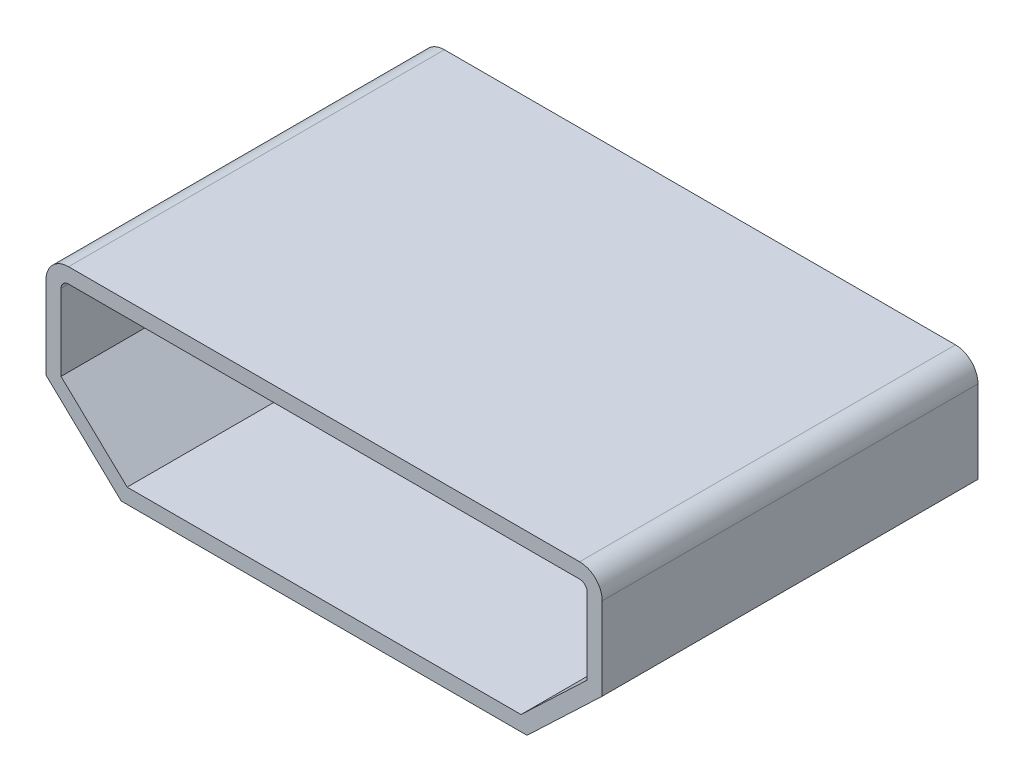
ISO-10303-21;
HEADER;
FILE_DESCRIPTION(('STEP AP214'),'2;1');
FILE_NAME('part.step','',(''),(''),'','','');
FILE_SCHEMA(('AUTOMOTIVE_DESIGN { 1 0 10303 214 1 1 1 1 }'));
ENDSEC;
DATA;
#1=APPLICATION_CONTEXT('core data for automotive mechanical design processes');
#2=APPLICATION_PROTOCOL_DEFINITION('international standard','automotive_design',2000,#1);
#3=PRODUCT_CONTEXT('',#1,'mechanical');
#4=PRODUCT('Part','Part','',(#3));
#5=PRODUCT_RELATED_PRODUCT_CATEGORY('part','',(#4));
#6=PRODUCT_DEFINITION_FORMATION('','',#4);
#7=PRODUCT_DEFINITION_CONTEXT('part definition',#1,'design');
#8=PRODUCT_DEFINITION('design','',#6,#7);
#9=PRODUCT_DEFINITION_SHAPE('','',#8);
#10=(LENGTH_UNIT() NAMED_UNIT(*) SI_UNIT(.MILLI.,.METRE.));
#11=(NAMED_UNIT(*) PLANE_ANGLE_UNIT() SI_UNIT($,.RADIAN.));
#12=(NAMED_UNIT(*) SI_UNIT($,.STERADIAN.) SOLID_ANGLE_UNIT());
#13=UNCERTAINTY_MEASURE_WITH_UNIT(LENGTH_MEASURE(1.E-05),#10,'distance_accuracy_value','');
#14=(GEOMETRIC_REPRESENTATION_CONTEXT(3) GLOBAL_UNCERTAINTY_ASSIGNED_CONTEXT((#13)) GLOBAL_UNIT_ASSIGNED_CONTEXT((#10,
#11,#12)) REPRESENTATION_CONTEXT('',''));
#15=CARTESIAN_POINT('',(0.,0.,0.));
#16=DIRECTION('',(0.,0.,1.));
#17=DIRECTION('',(1.,0.,0.));
#18=AXIS2_PLACEMENT_3D('',#15,#16,#17);
#19=CARTESIAN_POINT('',(3.7,2.35,2.5));
#20=DIRECTION('',(-1.,0.,0.));
#21=DIRECTION('',(0.,0.,1.));
#22=AXIS2_PLACEMENT_3D('',#19,#20,#21);
#23=PLANE('',#22);
#24=DIRECTION('',(0.,-1.,0.));
#25=VECTOR('',#24,1.);
#26=CARTESIAN_POINT('',(3.7,2.35,2.5));
#27=LINE('',#26,#25);
#28=CARTESIAN_POINT('',(3.7,2.05,2.5));
#29=VERTEX_POINT('',#28);
#30=CARTESIAN_POINT('',(3.7,0.95,2.5));
#31=VERTEX_POINT('',#30);
#32=EDGE_CURVE('E263',#29,#31,#27,.T.);
#33=ORIENTED_EDGE('',*,*,#32,.T.);
#34=DIRECTION('',(0.,0.,1.));
#35=VECTOR('',#34,1.);
#36=CARTESIAN_POINT('',(3.7,0.95,-2.5));
#37=LINE('',#36,#35);
#38=CARTESIAN_POINT('',(3.7,0.95,-2.5));
#39=VERTEX_POINT('',#38);
#40=EDGE_CURVE('E241',#39,#31,#37,.T.);
#41=ORIENTED_EDGE('',*,*,#40,.F.);
#42=DIRECTION('',(0.,-1.,0.));
#43=VECTOR('',#42,1.);
#44=CARTESIAN_POINT('',(3.7,2.35,-2.5));
#45=LINE('',#44,#43);
#46=CARTESIAN_POINT('',(3.7,2.05,-2.5));
#47=VERTEX_POINT('',#46);
#48=EDGE_CURVE('E11',#47,#39,#45,.T.);
#49=ORIENTED_EDGE('',*,*,#48,.F.);
#50=DIRECTION('',(0.,0.,1.));
#51=VECTOR('',#50,1.);
#52=CARTESIAN_POINT('',(3.7,2.05,-2.5));
#53=LINE('',#52,#51);
#54=EDGE_CURVE('E221',#47,#29,#53,.T.);
#55=ORIENTED_EDGE('',*,*,#54,.T.);
#56=EDGE_LOOP('',(#33,#41,#49,#55));
#57=FACE_BOUND('',#56,.T.);
#58=ADVANCED_FACE('F35',(#57),#23,.F.);
#59=CARTESIAN_POINT('',(0.,2.35,0.));
#60=DIRECTION('',(0.,-1.,0.));
#61=DIRECTION('',(0.,0.,-1.));
#62=AXIS2_PLACEMENT_3D('',#59,#60,#61);
#63=PLANE('',#62);
#64=DIRECTION('',(0.,0.,1.));
#65=VECTOR('',#64,1.);
#66=CARTESIAN_POINT('',(-3.4,2.35,-2.5));
#67=LINE('',#66,#65);
#68=CARTESIAN_POINT('',(-3.4,2.35,-2.5));
#69=VERTEX_POINT('',#68);
#70=CARTESIAN_POINT('',(-3.4,2.35,2.5));
#71=VERTEX_POINT('',#70);
#72=EDGE_CURVE('E233',#69,#71,#67,.T.);
#73=ORIENTED_EDGE('',*,*,#72,.T.);
#74=DIRECTION('',(1.,0.,0.));
#75=VECTOR('',#74,1.);
#76=CARTESIAN_POINT('',(-3.7,2.35,2.5));
#77=LINE('',#76,#75);
#78=CARTESIAN_POINT('',(3.4,2.35,2.5));
#79=VERTEX_POINT('',#78);
#80=EDGE_CURVE('E259',#71,#79,#77,.T.);
#81=ORIENTED_EDGE('',*,*,#80,.T.);
#82=DIRECTION('',(0.,0.,1.));
#83=VECTOR('',#82,1.);
#84=CARTESIAN_POINT('',(3.4,2.35,-2.5));
#85=LINE('',#84,#83);
#86=CARTESIAN_POINT('',(3.4,2.35,-2.5));
#87=VERTEX_POINT('',#86);
#88=EDGE_CURVE('E225',#87,#79,#85,.T.);
#89=ORIENTED_EDGE('',*,*,#88,.F.);
#90=DIRECTION('',(-1.,0.,0.));
#91=VECTOR('',#90,1.);
#92=CARTESIAN_POINT('',(-3.7,2.35,-2.5));
#93=LINE('',#92,#91);
#94=EDGE_CURVE('E256',#87,#69,#93,.T.);
#95=ORIENTED_EDGE('',*,*,#94,.T.);
#96=EDGE_LOOP('',(#73,#81,#89,#95));
#97=FACE_BOUND('',#96,.T.);
#98=ADVANCED_FACE('F297',(#97),#63,.F.);
#99=CARTESIAN_POINT('',(-3.7,2.35,-2.5));
#100=DIRECTION('',(0.,0.,1.));
#101=DIRECTION('',(1.,0.,0.));
#102=AXIS2_PLACEMENT_3D('',#99,#100,#101);
#103=PLANE('',#102);
#104=ORIENTED_EDGE('',*,*,#48,.T.);
#105=DIRECTION('',(-0.724999433594414,-0.688749461914693,0.));
#106=VECTOR('',#105,1.);
#107=CARTESIAN_POINT('',(2.7,0.,-2.5));
#108=LINE('',#107,#106);
#109=CARTESIAN_POINT('',(2.7,0.,-2.5));
#110=VERTEX_POINT('',#109);
#111=EDGE_CURVE('E238',#39,#110,#108,.T.);
#112=ORIENTED_EDGE('',*,*,#111,.T.);
#113=DIRECTION('',(-1.,0.,0.));
#114=VECTOR('',#113,1.);
#115=CARTESIAN_POINT('',(-3.7,0.,-2.5));
#116=LINE('',#115,#114);
#117=CARTESIAN_POINT('',(-2.7,0.,-2.5));
#118=VERTEX_POINT('',#117);
#119=EDGE_CURVE('E254',#110,#118,#116,.T.);
#120=ORIENTED_EDGE('',*,*,#119,.T.);
#121=DIRECTION('',(-0.724999433594414,0.688749461914693,0.));
#122=VECTOR('',#121,1.);
#123=CARTESIAN_POINT('',(-2.7,0.,-2.5));
#124=LINE('',#123,#122);
#125=CARTESIAN_POINT('',(-3.7,0.95,-2.5));
#126=VERTEX_POINT('',#125);
#127=EDGE_CURVE('E246',#118,#126,#124,.T.);
#128=ORIENTED_EDGE('',*,*,#127,.T.);
#129=DIRECTION('',(0.,-1.,0.));
#130=VECTOR('',#129,1.);
#131=CARTESIAN_POINT('',(-3.7,2.35,-2.5));
#132=LINE('',#131,#130);
#133=CARTESIAN_POINT('',(-3.7,2.05,-2.5));
#134=VERTEX_POINT('',#133);
#135=EDGE_CURVE('E42',#134,#126,#132,.T.);
#136=ORIENTED_EDGE('',*,*,#135,.F.);
#137=CARTESIAN_POINT('',(-3.4,2.05,-2.5));
#138=DIRECTION('',(0.,0.,-1.));
#139=DIRECTION('',(-1.,0.,0.));
#140=AXIS2_PLACEMENT_3D('',#137,#138,#139);
#141=CIRCLE('',#140,0.3);
#142=EDGE_CURVE('E230',#134,#69,#141,.T.);
#143=ORIENTED_EDGE('',*,*,#142,.T.);
#144=ORIENTED_EDGE('',*,*,#94,.F.);
#145=CARTESIAN_POINT('',(3.4,2.05,-2.5));
#146=DIRECTION('',(0.,0.,-1.));
#147=DIRECTION('',(1.,0.,0.));
#148=AXIS2_PLACEMENT_3D('',#145,#146,#147);
#149=CIRCLE('',#148,0.3);
#150=EDGE_CURVE('E218',#87,#47,#149,.T.);
#151=ORIENTED_EDGE('',*,*,#150,.T.);
#152=EDGE_LOOP('',(#104,#112,#120,#128,#136,#143,#144,#151));
#153=FACE_BOUND('',#152,.T.);
#154=ADVANCED_FACE('F279',(#153),#103,.F.);
#155=CARTESIAN_POINT('',(-3.7,2.35,2.5));
#156=DIRECTION('',(1.,0.,0.));
#157=DIRECTION('',(0.,0.,-1.));
#158=AXIS2_PLACEMENT_3D('',#155,#156,#157);
#159=PLANE('',#158);
#160=DIRECTION('',(0.,-1.,0.));
#161=VECTOR('',#160,1.);
#162=CARTESIAN_POINT('',(-3.7,2.35,2.5));
#163=LINE('',#162,#161);
#164=CARTESIAN_POINT('',(-3.7,2.05,2.5));
#165=VERTEX_POINT('',#164);
#166=CARTESIAN_POINT('',(-3.7,0.95,2.5));
#167=VERTEX_POINT('',#166);
#168=EDGE_CURVE('E270',#165,#167,#163,.T.);
#169=ORIENTED_EDGE('',*,*,#168,.F.);
#170=DIRECTION('',(0.,0.,1.));
#171=VECTOR('',#170,1.);
#172=CARTESIAN_POINT('',(-3.7,2.05,-2.5));
#173=LINE('',#172,#171);
#174=EDGE_CURVE('E224',#134,#165,#173,.T.);
#175=ORIENTED_EDGE('',*,*,#174,.F.);
#176=ORIENTED_EDGE('',*,*,#135,.T.);
#177=DIRECTION('',(0.,0.,1.));
#178=VECTOR('',#177,1.);
#179=CARTESIAN_POINT('',(-3.7,0.95,-2.5));
#180=LINE('',#179,#178);
#181=EDGE_CURVE('E251',#126,#167,#180,.T.);
#182=ORIENTED_EDGE('',*,*,#181,.T.);
#183=EDGE_LOOP('',(#169,#175,#176,#182));
#184=FACE_BOUND('',#183,.T.);
#185=ADVANCED_FACE('F277',(#184),#159,.F.);
#186=CARTESIAN_POINT('',(-3.7,2.35,2.5));
#187=DIRECTION('',(0.,0.,-1.));
#188=DIRECTION('',(-1.,0.,0.));
#189=AXIS2_PLACEMENT_3D('',#186,#187,#188);
#190=PLANE('',#189);
#191=DIRECTION('',(-1.,0.,0.));
#192=VECTOR('',#191,1.);
#193=CARTESIAN_POINT('',(-3.4,2.15,2.5));
#194=LINE('',#193,#192);
#195=CARTESIAN_POINT('',(3.4,2.15,2.5));
#196=VERTEX_POINT('',#195);
#197=CARTESIAN_POINT('',(-3.4,2.15,2.5));
#198=VERTEX_POINT('',#197);
#199=EDGE_CURVE('E188',#196,#198,#194,.T.);
#200=ORIENTED_EDGE('',*,*,#199,.F.);
#201=CARTESIAN_POINT('',(3.4,2.05,2.5));
#202=DIRECTION('',(0.,0.,1.));
#203=DIRECTION('',(1.,0.,0.));
#204=AXIS2_PLACEMENT_3D('',#201,#202,#203);
#205=CIRCLE('',#204,0.0999999999999998);
#206=CARTESIAN_POINT('',(3.5,2.05,2.5));
#207=VERTEX_POINT('',#206);
#208=EDGE_CURVE('E49',#207,#196,#205,.T.);
#209=ORIENTED_EDGE('',*,*,#208,.F.);
#210=DIRECTION('',(0.,1.,0.));
#211=VECTOR('',#210,1.);
#212=CARTESIAN_POINT('',(3.5,2.05,2.5));
#213=LINE('',#212,#211);
#214=CARTESIAN_POINT('',(3.5,1.03586228448267,2.5));
#215=VERTEX_POINT('',#214);
#216=EDGE_CURVE('E168',#215,#207,#213,.T.);
#217=ORIENTED_EDGE('',*,*,#216,.F.);
#218=DIRECTION('',(0.724999433594414,0.688749461914693,0.));
#219=VECTOR('',#218,1.);
#220=CARTESIAN_POINT('',(3.5,1.03586228448267,2.5));
#221=LINE('',#220,#219);
#222=CARTESIAN_POINT('',(2.62014496370245,0.2,2.5));
#223=VERTEX_POINT('',#222);
#224=EDGE_CURVE('E171',#223,#215,#221,.T.);
#225=ORIENTED_EDGE('',*,*,#224,.F.);
#226=DIRECTION('',(1.,0.,0.));
#227=VECTOR('',#226,1.);
#228=CARTESIAN_POINT('',(-2.62014496370245,0.2,2.5));
#229=LINE('',#228,#227);
#230=CARTESIAN_POINT('',(-2.62014496370245,0.2,2.5));
#231=VERTEX_POINT('',#230);
#232=EDGE_CURVE('E199',#231,#223,#229,.T.);
#233=ORIENTED_EDGE('',*,*,#232,.F.);
#234=DIRECTION('',(0.724999433594414,-0.688749461914693,0.));
#235=VECTOR('',#234,1.);
#236=CARTESIAN_POINT('',(-2.62014496370245,0.2,2.5));
#237=LINE('',#236,#235);
#238=CARTESIAN_POINT('',(-3.5,1.03586228448267,2.5));
#239=VERTEX_POINT('',#238);
#240=EDGE_CURVE('E196',#239,#231,#237,.T.);
#241=ORIENTED_EDGE('',*,*,#240,.F.);
#242=DIRECTION('',(0.,-1.,0.));
#243=VECTOR('',#242,1.);
#244=CARTESIAN_POINT('',(-3.5,2.05,2.5));
#245=LINE('',#244,#243);
#246=CARTESIAN_POINT('',(-3.5,2.05,2.5));
#247=VERTEX_POINT('',#246);
#248=EDGE_CURVE('E193',#247,#239,#245,.T.);
#249=ORIENTED_EDGE('',*,*,#248,.F.);
#250=CARTESIAN_POINT('',(-3.4,2.05,2.5));
#251=DIRECTION('',(0.,0.,1.));
#252=DIRECTION('',(1.,0.,0.));
#253=AXIS2_PLACEMENT_3D('',#250,#251,#252);
#254=CIRCLE('',#253,0.0999999999999998);
#255=EDGE_CURVE('E190',#198,#247,#254,.T.);
#256=ORIENTED_EDGE('',*,*,#255,.F.);
#257=EDGE_LOOP('',(#200,#209,#217,#225,#233,#241,#249,#256));
#258=FACE_BOUND('',#257,.T.);
#259=DIRECTION('',(1.,0.,0.));
#260=VECTOR('',#259,1.);
#261=CARTESIAN_POINT('',(-3.7,0.,2.5));
#262=LINE('',#261,#260);
#263=CARTESIAN_POINT('',(-2.7,0.,2.5));
#264=VERTEX_POINT('',#263);
#265=CARTESIAN_POINT('',(2.7,0.,2.5));
#266=VERTEX_POINT('',#265);
#267=EDGE_CURVE('E260',#264,#266,#262,.T.);
#268=ORIENTED_EDGE('',*,*,#267,.T.);
#269=DIRECTION('',(-0.724999433594414,-0.688749461914693,0.));
#270=VECTOR('',#269,1.);
#271=CARTESIAN_POINT('',(2.7,0.,2.5));
#272=LINE('',#271,#270);
#273=EDGE_CURVE('E206',#31,#266,#272,.T.);
#274=ORIENTED_EDGE('',*,*,#273,.F.);
#275=ORIENTED_EDGE('',*,*,#32,.F.);
#276=CARTESIAN_POINT('',(3.4,2.05,2.5));
#277=DIRECTION('',(0.,0.,-1.));
#278=DIRECTION('',(1.,0.,0.));
#279=AXIS2_PLACEMENT_3D('',#276,#277,#278);
#280=CIRCLE('',#279,0.3);
#281=EDGE_CURVE('E222',#79,#29,#280,.T.);
#282=ORIENTED_EDGE('',*,*,#281,.F.);
#283=ORIENTED_EDGE('',*,*,#80,.F.);
#284=CARTESIAN_POINT('',(-3.4,2.05,2.5));
#285=DIRECTION('',(0.,0.,-1.));
#286=DIRECTION('',(-1.,0.,0.));
#287=AXIS2_PLACEMENT_3D('',#284,#285,#286);
#288=CIRCLE('',#287,0.3);
#289=EDGE_CURVE('E57',#165,#71,#288,.T.);
#290=ORIENTED_EDGE('',*,*,#289,.F.);
#291=ORIENTED_EDGE('',*,*,#168,.T.);
#292=DIRECTION('',(-0.724999433594414,0.688749461914693,0.));
#293=VECTOR('',#292,1.);
#294=CARTESIAN_POINT('',(-2.7,0.,2.5));
#295=LINE('',#294,#293);
#296=EDGE_CURVE('E227',#264,#167,#295,.T.);
#297=ORIENTED_EDGE('',*,*,#296,.F.);
#298=EDGE_LOOP('',(#268,#274,#275,#282,#283,#290,#291,#297));
#299=FACE_BOUND('',#298,.T.);
#300=ADVANCED_FACE('F291',(#258,#299),#190,.F.);
#301=CARTESIAN_POINT('',(0.,0.,0.));
#302=DIRECTION('',(0.,-1.,0.));
#303=DIRECTION('',(0.,0.,-1.));
#304=AXIS2_PLACEMENT_3D('',#301,#302,#303);
#305=PLANE('',#304);
#306=DIRECTION('',(0.,0.,1.));
#307=VECTOR('',#306,1.);
#308=CARTESIAN_POINT('',(2.7,0.,-2.5));
#309=LINE('',#308,#307);
#310=EDGE_CURVE('E235',#110,#266,#309,.T.);
#311=ORIENTED_EDGE('',*,*,#310,.T.);
#312=ORIENTED_EDGE('',*,*,#267,.F.);
#313=DIRECTION('',(0.,0.,1.));
#314=VECTOR('',#313,1.);
#315=CARTESIAN_POINT('',(-2.7,0.,-2.5));
#316=LINE('',#315,#314);
#317=EDGE_CURVE('E249',#118,#264,#316,.T.);
#318=ORIENTED_EDGE('',*,*,#317,.F.);
#319=ORIENTED_EDGE('',*,*,#119,.F.);
#320=EDGE_LOOP('',(#311,#312,#318,#319));
#321=FACE_BOUND('',#320,.T.);
#322=ADVANCED_FACE('F288',(#321),#305,.T.);
#323=CARTESIAN_POINT('',(-2.7,0.,-2.5));
#324=DIRECTION('',(0.688749461914693,0.724999433594414,0.));
#325=DIRECTION('',(-0.724999433594414,0.688749461914693,0.));
#326=AXIS2_PLACEMENT_3D('',#323,#324,#325);
#327=PLANE('',#326);
#328=ORIENTED_EDGE('',*,*,#296,.T.);
#329=ORIENTED_EDGE('',*,*,#181,.F.);
#330=ORIENTED_EDGE('',*,*,#127,.F.);
#331=ORIENTED_EDGE('',*,*,#317,.T.);
#332=EDGE_LOOP('',(#328,#329,#330,#331));
#333=FACE_BOUND('',#332,.T.);
#334=ADVANCED_FACE('F284',(#333),#327,.F.);
#335=CARTESIAN_POINT('',(2.7,0.,-2.5));
#336=DIRECTION('',(-0.688749461914693,0.724999433594414,0.));
#337=DIRECTION('',(-0.724999433594414,-0.688749461914693,0.));
#338=AXIS2_PLACEMENT_3D('',#335,#336,#337);
#339=PLANE('',#338);
#340=ORIENTED_EDGE('',*,*,#273,.T.);
#341=ORIENTED_EDGE('',*,*,#310,.F.);
#342=ORIENTED_EDGE('',*,*,#111,.F.);
#343=ORIENTED_EDGE('',*,*,#40,.T.);
#344=EDGE_LOOP('',(#340,#341,#342,#343));
#345=FACE_BOUND('',#344,.T.);
#346=ADVANCED_FACE('F308',(#345),#339,.F.);
#347=CARTESIAN_POINT('',(3.4,2.05,-2.5));
#348=DIRECTION('',(0.,0.,1.));
#349=DIRECTION('',(1.,0.,0.));
#350=AXIS2_PLACEMENT_3D('',#347,#348,#349);
#351=CYLINDRICAL_SURFACE('',#350,0.3);
#352=ORIENTED_EDGE('',*,*,#281,.T.);
#353=ORIENTED_EDGE('',*,*,#54,.F.);
#354=ORIENTED_EDGE('',*,*,#150,.F.);
#355=ORIENTED_EDGE('',*,*,#88,.T.);
#356=EDGE_LOOP('',(#352,#353,#354,#355));
#357=FACE_BOUND('',#356,.T.);
#358=ADVANCED_FACE('F300',(#357),#351,.T.);
#359=CARTESIAN_POINT('',(-3.4,2.05,-2.5));
#360=DIRECTION('',(0.,0.,1.));
#361=DIRECTION('',(1.,0.,0.));
#362=AXIS2_PLACEMENT_3D('',#359,#360,#361);
#363=CYLINDRICAL_SURFACE('',#362,0.3);
#364=ORIENTED_EDGE('',*,*,#289,.T.);
#365=ORIENTED_EDGE('',*,*,#72,.F.);
#366=ORIENTED_EDGE('',*,*,#142,.F.);
#367=ORIENTED_EDGE('',*,*,#174,.T.);
#368=EDGE_LOOP('',(#364,#365,#366,#367));
#369=FACE_BOUND('',#368,.T.);
#370=ADVANCED_FACE('F298',(#369),#363,.T.);
#371=CARTESIAN_POINT('',(3.4,2.05,-2.2));
#372=DIRECTION('',(0.,0.,1.));
#373=DIRECTION('',(1.,0.,0.));
#374=AXIS2_PLACEMENT_3D('',#371,#372,#373);
#375=CYLINDRICAL_SURFACE('',#374,0.0999999999999998);
#376=ORIENTED_EDGE('',*,*,#208,.T.);
#377=DIRECTION('',(0.,0.,1.));
#378=VECTOR('',#377,1.);
#379=CARTESIAN_POINT('',(3.4,2.15,-2.2));
#380=LINE('',#379,#378);
#381=CARTESIAN_POINT('',(3.4,2.15,-2.2));
#382=VERTEX_POINT('',#381);
#383=EDGE_CURVE('E145',#382,#196,#380,.T.);
#384=ORIENTED_EDGE('',*,*,#383,.F.);
#385=CARTESIAN_POINT('',(3.4,2.05,-2.2));
#386=DIRECTION('',(0.,0.,1.));
#387=DIRECTION('',(1.,0.,0.));
#388=AXIS2_PLACEMENT_3D('',#385,#386,#387);
#389=CIRCLE('',#388,0.0999999999999998);
#390=CARTESIAN_POINT('',(3.5,2.05,-2.2));
#391=VERTEX_POINT('',#390);
#392=EDGE_CURVE('E149',#391,#382,#389,.T.);
#393=ORIENTED_EDGE('',*,*,#392,.F.);
#394=DIRECTION('',(0.,0.,1.));
#395=VECTOR('',#394,1.);
#396=CARTESIAN_POINT('',(3.5,2.05,-2.2));
#397=LINE('',#396,#395);
#398=EDGE_CURVE('E204',#391,#207,#397,.T.);
#399=ORIENTED_EDGE('',*,*,#398,.T.);
#400=EDGE_LOOP('',(#376,#384,#393,#399));
#401=FACE_BOUND('',#400,.T.);
#402=ADVANCED_FACE('F147',(#401),#375,.F.);
#403=CARTESIAN_POINT('',(3.5,2.05,-2.2));
#404=DIRECTION('',(1.,0.,0.));
#405=DIRECTION('',(0.,0.,-1.));
#406=AXIS2_PLACEMENT_3D('',#403,#404,#405);
#407=PLANE('',#406);
#408=ORIENTED_EDGE('',*,*,#216,.T.);
#409=ORIENTED_EDGE('',*,*,#398,.F.);
#410=DIRECTION('',(0.,1.,0.));
#411=VECTOR('',#410,1.);
#412=CARTESIAN_POINT('',(3.5,2.05,-2.2));
#413=LINE('',#412,#411);
#414=CARTESIAN_POINT('',(3.5,1.03586228448267,-2.2));
#415=VERTEX_POINT('',#414);
#416=EDGE_CURVE('E155',#415,#391,#413,.T.);
#417=ORIENTED_EDGE('',*,*,#416,.F.);
#418=DIRECTION('',(0.,0.,1.));
#419=VECTOR('',#418,1.);
#420=CARTESIAN_POINT('',(3.5,1.03586228448267,-2.2));
#421=LINE('',#420,#419);
#422=EDGE_CURVE('E207',#415,#215,#421,.T.);
#423=ORIENTED_EDGE('',*,*,#422,.T.);
#424=EDGE_LOOP('',(#408,#409,#417,#423));
#425=FACE_BOUND('',#424,.T.);
#426=ADVANCED_FACE('F306',(#425),#407,.F.);
#427=CARTESIAN_POINT('',(3.5,1.03586228448267,-2.2));
#428=DIRECTION('',(0.688749461914693,-0.724999433594414,0.));
#429=DIRECTION('',(0.724999433594414,0.688749461914693,0.));
#430=AXIS2_PLACEMENT_3D('',#427,#428,#429);
#431=PLANE('',#430);
#432=ORIENTED_EDGE('',*,*,#224,.T.);
#433=ORIENTED_EDGE('',*,*,#422,.F.);
#434=DIRECTION('',(0.724999433594414,0.688749461914693,0.));
#435=VECTOR('',#434,1.);
#436=CARTESIAN_POINT('',(3.5,1.03586228448267,-2.2));
#437=LINE('',#436,#435);
#438=CARTESIAN_POINT('',(2.62014496370245,0.2,-2.2));
#439=VERTEX_POINT('',#438);
#440=EDGE_CURVE('E184',#439,#415,#437,.T.);
#441=ORIENTED_EDGE('',*,*,#440,.F.);
#442=DIRECTION('',(0.,0.,1.));
#443=VECTOR('',#442,1.);
#444=CARTESIAN_POINT('',(2.62014496370245,0.2,-2.2));
#445=LINE('',#444,#443);
#446=EDGE_CURVE('E209',#439,#223,#445,.T.);
#447=ORIENTED_EDGE('',*,*,#446,.T.);
#448=EDGE_LOOP('',(#432,#433,#441,#447));
#449=FACE_BOUND('',#448,.T.);
#450=ADVANCED_FACE('F384',(#449),#431,.F.);
#451=CARTESIAN_POINT('',(-2.62014496370245,0.2,-2.2));
#452=DIRECTION('',(0.,-1.,0.));
#453=DIRECTION('',(0.,0.,-1.));
#454=AXIS2_PLACEMENT_3D('',#451,#452,#453);
#455=PLANE('',#454);
#456=ORIENTED_EDGE('',*,*,#232,.T.);
#457=ORIENTED_EDGE('',*,*,#446,.F.);
#458=DIRECTION('',(1.,0.,0.));
#459=VECTOR('',#458,1.);
#460=CARTESIAN_POINT('',(-2.62014496370245,0.2,-2.2));
#461=LINE('',#460,#459);
#462=CARTESIAN_POINT('',(-2.62014496370245,0.2,-2.2));
#463=VERTEX_POINT('',#462);
#464=EDGE_CURVE('E181',#463,#439,#461,.T.);
#465=ORIENTED_EDGE('',*,*,#464,.F.);
#466=DIRECTION('',(0.,0.,1.));
#467=VECTOR('',#466,1.);
#468=CARTESIAN_POINT('',(-2.62014496370245,0.2,-2.2));
#469=LINE('',#468,#467);
#470=EDGE_CURVE('E211',#463,#231,#469,.T.);
#471=ORIENTED_EDGE('',*,*,#470,.T.);
#472=EDGE_LOOP('',(#456,#457,#465,#471));
#473=FACE_BOUND('',#472,.T.);
#474=ADVANCED_FACE('F393',(#473),#455,.F.);
#475=CARTESIAN_POINT('',(-2.62014496370245,0.2,-2.2));
#476=DIRECTION('',(-0.688749461914693,-0.724999433594414,0.));
#477=DIRECTION('',(0.724999433594414,-0.688749461914693,0.));
#478=AXIS2_PLACEMENT_3D('',#475,#476,#477);
#479=PLANE('',#478);
#480=ORIENTED_EDGE('',*,*,#240,.T.);
#481=ORIENTED_EDGE('',*,*,#470,.F.);
#482=DIRECTION('',(0.724999433594414,-0.688749461914693,0.));
#483=VECTOR('',#482,1.);
#484=CARTESIAN_POINT('',(-2.62014496370245,0.2,-2.2));
#485=LINE('',#484,#483);
#486=CARTESIAN_POINT('',(-3.5,1.03586228448267,-2.2));
#487=VERTEX_POINT('',#486);
#488=EDGE_CURVE('E178',#487,#463,#485,.T.);
#489=ORIENTED_EDGE('',*,*,#488,.F.);
#490=DIRECTION('',(0.,0.,1.));
#491=VECTOR('',#490,1.);
#492=CARTESIAN_POINT('',(-3.5,1.03586228448267,-2.2));
#493=LINE('',#492,#491);
#494=EDGE_CURVE('E213',#487,#239,#493,.T.);
#495=ORIENTED_EDGE('',*,*,#494,.T.);
#496=EDGE_LOOP('',(#480,#481,#489,#495));
#497=FACE_BOUND('',#496,.T.);
#498=ADVANCED_FACE('F402',(#497),#479,.F.);
#499=CARTESIAN_POINT('',(-3.5,2.05,-2.2));
#500=DIRECTION('',(-1.,0.,0.));
#501=DIRECTION('',(0.,0.,1.));
#502=AXIS2_PLACEMENT_3D('',#499,#500,#501);
#503=PLANE('',#502);
#504=ORIENTED_EDGE('',*,*,#248,.T.);
#505=ORIENTED_EDGE('',*,*,#494,.F.);
#506=DIRECTION('',(0.,-1.,0.));
#507=VECTOR('',#506,1.);
#508=CARTESIAN_POINT('',(-3.5,2.05,-2.2));
#509=LINE('',#508,#507);
#510=CARTESIAN_POINT('',(-3.5,2.05,-2.2));
#511=VERTEX_POINT('',#510);
#512=EDGE_CURVE('E175',#511,#487,#509,.T.);
#513=ORIENTED_EDGE('',*,*,#512,.F.);
#514=DIRECTION('',(0.,0.,1.));
#515=VECTOR('',#514,1.);
#516=CARTESIAN_POINT('',(-3.5,2.05,-2.2));
#517=LINE('',#516,#515);
#518=EDGE_CURVE('E215',#511,#247,#517,.T.);
#519=ORIENTED_EDGE('',*,*,#518,.T.);
#520=EDGE_LOOP('',(#504,#505,#513,#519));
#521=FACE_BOUND('',#520,.T.);
#522=ADVANCED_FACE('F411',(#521),#503,.F.);
#523=CARTESIAN_POINT('',(-3.4,2.05,-2.2));
#524=DIRECTION('',(0.,0.,1.));
#525=DIRECTION('',(1.,0.,0.));
#526=AXIS2_PLACEMENT_3D('',#523,#524,#525);
#527=CYLINDRICAL_SURFACE('',#526,0.0999999999999998);
#528=ORIENTED_EDGE('',*,*,#255,.T.);
#529=ORIENTED_EDGE('',*,*,#518,.F.);
#530=CARTESIAN_POINT('',(-3.4,2.05,-2.2));
#531=DIRECTION('',(0.,0.,1.));
#532=DIRECTION('',(1.,0.,0.));
#533=AXIS2_PLACEMENT_3D('',#530,#531,#532);
#534=CIRCLE('',#533,0.0999999999999998);
#535=CARTESIAN_POINT('',(-3.4,2.15,-2.2));
#536=VERTEX_POINT('',#535);
#537=EDGE_CURVE('E163',#536,#511,#534,.T.);
#538=ORIENTED_EDGE('',*,*,#537,.F.);
#539=DIRECTION('',(0.,0.,1.));
#540=VECTOR('',#539,1.);
#541=CARTESIAN_POINT('',(-3.4,2.15,-2.2));
#542=LINE('',#541,#540);
#543=EDGE_CURVE('E154',#536,#198,#542,.T.);
#544=ORIENTED_EDGE('',*,*,#543,.T.);
#545=EDGE_LOOP('',(#528,#529,#538,#544));
#546=FACE_BOUND('',#545,.T.);
#547=ADVANCED_FACE('F420',(#546),#527,.F.);
#548=CARTESIAN_POINT('',(-3.4,2.15,-2.2));
#549=DIRECTION('',(0.,1.,0.));
#550=DIRECTION('',(0.,0.,1.));
#551=AXIS2_PLACEMENT_3D('',#548,#549,#550);
#552=PLANE('',#551);
#553=ORIENTED_EDGE('',*,*,#199,.T.);
#554=ORIENTED_EDGE('',*,*,#543,.F.);
#555=DIRECTION('',(-1.,0.,0.));
#556=VECTOR('',#555,1.);
#557=CARTESIAN_POINT('',(-3.4,2.15,-2.2));
#558=LINE('',#557,#556);
#559=EDGE_CURVE('E158',#382,#536,#558,.T.);
#560=ORIENTED_EDGE('',*,*,#559,.F.);
#561=ORIENTED_EDGE('',*,*,#383,.T.);
#562=EDGE_LOOP('',(#553,#554,#560,#561));
#563=FACE_BOUND('',#562,.T.);
#564=ADVANCED_FACE('F159',(#563),#552,.F.);
#565=CARTESIAN_POINT('',(3.4,2.05,-2.2));
#566=DIRECTION('',(0.,0.,1.));
#567=DIRECTION('',(1.,0.,0.));
#568=AXIS2_PLACEMENT_3D('',#565,#566,#567);
#569=PLANE('',#568);
#570=ORIENTED_EDGE('',*,*,#392,.T.);
#571=ORIENTED_EDGE('',*,*,#559,.T.);
#572=ORIENTED_EDGE('',*,*,#537,.T.);
#573=ORIENTED_EDGE('',*,*,#512,.T.);
#574=ORIENTED_EDGE('',*,*,#488,.T.);
#575=ORIENTED_EDGE('',*,*,#464,.T.);
#576=ORIENTED_EDGE('',*,*,#440,.T.);
#577=ORIENTED_EDGE('',*,*,#416,.T.);
#578=EDGE_LOOP('',(#570,#571,#572,#573,#574,#575,#576,#577));
#579=FACE_BOUND('',#578,.T.);
#580=ADVANCED_FACE('F165',(#579),#569,.T.);
#581=CLOSED_SHELL('',(#58,#98,#154,#185,#300,#322,#334,#346,#358,#370,#402,#426,#450,#474,#498,
#522,#547,#564,#580));
#582=MANIFOLD_SOLID_BREP('B2',#581);
#583=ADVANCED_BREP_SHAPE_REPRESENTATION('',(#18,#582),#14);
#584=SHAPE_DEFINITION_REPRESENTATION(#9,#583);
ENDSEC;
END-ISO-10303-21;
